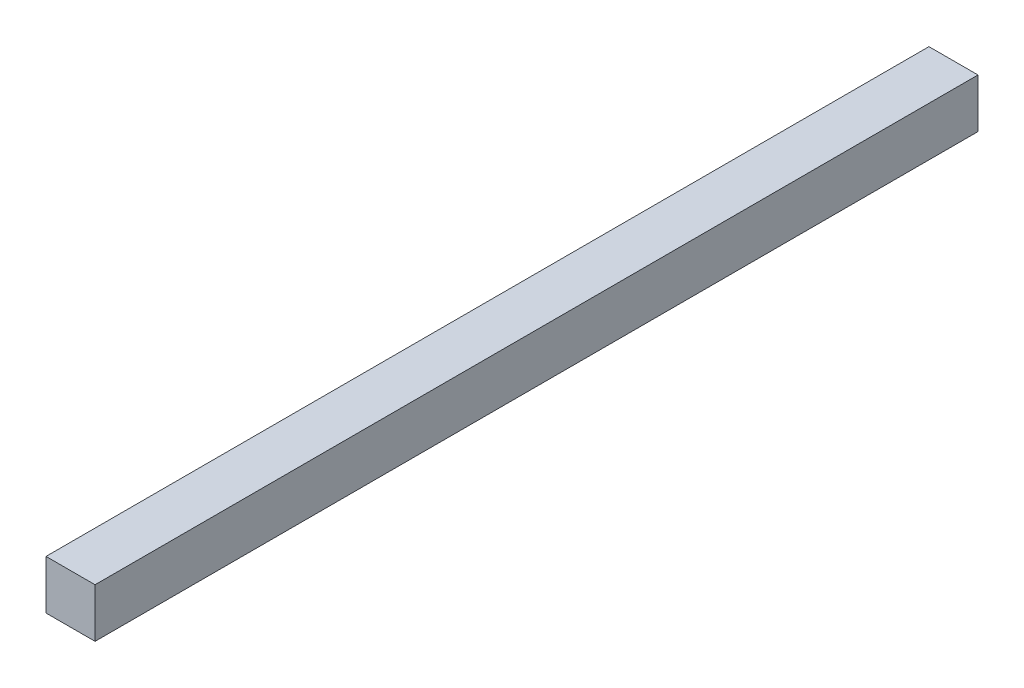
ISO-10303-21;
HEADER;
FILE_DESCRIPTION(('STEP AP214'),'2;1');
FILE_NAME('part.step','',(''),(''),'','','');
FILE_SCHEMA(('AUTOMOTIVE_DESIGN { 1 0 10303 214 1 1 1 1 }'));
ENDSEC;
DATA;
#1=APPLICATION_CONTEXT('core data for automotive mechanical design processes');
#2=APPLICATION_PROTOCOL_DEFINITION('international standard','automotive_design',2000,#1);
#3=PRODUCT_CONTEXT('',#1,'mechanical');
#4=PRODUCT('Part','Part','',(#3));
#5=PRODUCT_RELATED_PRODUCT_CATEGORY('part','',(#4));
#6=PRODUCT_DEFINITION_FORMATION('','',#4);
#7=PRODUCT_DEFINITION_CONTEXT('part definition',#1,'design');
#8=PRODUCT_DEFINITION('design','',#6,#7);
#9=PRODUCT_DEFINITION_SHAPE('','',#8);
#10=(LENGTH_UNIT() NAMED_UNIT(*) SI_UNIT(.MILLI.,.METRE.));
#11=(NAMED_UNIT(*) PLANE_ANGLE_UNIT() SI_UNIT($,.RADIAN.));
#12=(NAMED_UNIT(*) SI_UNIT($,.STERADIAN.) SOLID_ANGLE_UNIT());
#13=UNCERTAINTY_MEASURE_WITH_UNIT(LENGTH_MEASURE(1.E-05),#10,'distance_accuracy_value','');
#14=(GEOMETRIC_REPRESENTATION_CONTEXT(3) GLOBAL_UNCERTAINTY_ASSIGNED_CONTEXT((#13)) GLOBAL_UNIT_ASSIGNED_CONTEXT((#10,
#11,#12)) REPRESENTATION_CONTEXT('',''));
#15=CARTESIAN_POINT('',(0.,0.,0.));
#16=DIRECTION('',(0.,0.,1.));
#17=DIRECTION('',(1.,0.,0.));
#18=AXIS2_PLACEMENT_3D('',#15,#16,#17);
#19=CARTESIAN_POINT('',(0.,0.,457.2));
#20=DIRECTION('',(1.,0.,0.));
#21=DIRECTION('',(0.,1.,0.));
#22=AXIS2_PLACEMENT_3D('',#19,#20,#21);
#23=PLANE('',#22);
#24=DIRECTION('',(0.,-1.,0.));
#25=VECTOR('',#24,1.);
#26=CARTESIAN_POINT('',(0.,0.,0.));
#27=LINE('',#26,#25);
#28=CARTESIAN_POINT('',(0.,0.,0.));
#29=VERTEX_POINT('',#28);
#30=CARTESIAN_POINT('',(0.,-25.4,0.));
#31=VERTEX_POINT('',#30);
#32=EDGE_CURVE('E98',#29,#31,#27,.T.);
#33=ORIENTED_EDGE('',*,*,#32,.F.);
#34=DIRECTION('',(0.,0.,-1.));
#35=VECTOR('',#34,1.);
#36=CARTESIAN_POINT('',(0.,0.,457.2));
#37=LINE('',#36,#35);
#38=CARTESIAN_POINT('',(0.,0.,457.2));
#39=VERTEX_POINT('',#38);
#40=EDGE_CURVE('E11',#39,#29,#37,.T.);
#41=ORIENTED_EDGE('',*,*,#40,.F.);
#42=DIRECTION('',(0.,-1.,0.));
#43=VECTOR('',#42,1.);
#44=CARTESIAN_POINT('',(0.,0.,457.2));
#45=LINE('',#44,#43);
#46=CARTESIAN_POINT('',(0.,-25.4,457.2));
#47=VERTEX_POINT('',#46);
#48=EDGE_CURVE('E93',#39,#47,#45,.T.);
#49=ORIENTED_EDGE('',*,*,#48,.T.);
#50=DIRECTION('',(0.,0.,-1.));
#51=VECTOR('',#50,1.);
#52=CARTESIAN_POINT('',(0.,-25.4,457.2));
#53=LINE('',#52,#51);
#54=EDGE_CURVE('E36',#47,#31,#53,.T.);
#55=ORIENTED_EDGE('',*,*,#54,.T.);
#56=EDGE_LOOP('',(#33,#41,#49,#55));
#57=FACE_BOUND('',#56,.T.);
#58=ADVANCED_FACE('F33',(#57),#23,.T.);
#59=CARTESIAN_POINT('',(0.,0.,457.2));
#60=DIRECTION('',(0.,-1.,0.));
#61=DIRECTION('',(0.,0.,-1.));
#62=AXIS2_PLACEMENT_3D('',#59,#60,#61);
#63=PLANE('',#62);
#64=DIRECTION('',(-1.,0.,0.));
#65=VECTOR('',#64,1.);
#66=CARTESIAN_POINT('',(0.,0.,0.));
#67=LINE('',#66,#65);
#68=CARTESIAN_POINT('',(-25.4,0.,0.));
#69=VERTEX_POINT('',#68);
#70=EDGE_CURVE('E66',#29,#69,#67,.T.);
#71=ORIENTED_EDGE('',*,*,#70,.T.);
#72=DIRECTION('',(0.,0.,-1.));
#73=VECTOR('',#72,1.);
#74=CARTESIAN_POINT('',(-25.4,0.,457.2));
#75=LINE('',#74,#73);
#76=CARTESIAN_POINT('',(-25.4,0.,457.2));
#77=VERTEX_POINT('',#76);
#78=EDGE_CURVE('E42',#77,#69,#75,.T.);
#79=ORIENTED_EDGE('',*,*,#78,.F.);
#80=DIRECTION('',(-1.,0.,0.));
#81=VECTOR('',#80,1.);
#82=CARTESIAN_POINT('',(0.,0.,457.2));
#83=LINE('',#82,#81);
#84=EDGE_CURVE('E83',#39,#77,#83,.T.);
#85=ORIENTED_EDGE('',*,*,#84,.F.);
#86=ORIENTED_EDGE('',*,*,#40,.T.);
#87=EDGE_LOOP('',(#71,#79,#85,#86));
#88=FACE_BOUND('',#87,.T.);
#89=ADVANCED_FACE('F108',(#88),#63,.F.);
#90=CARTESIAN_POINT('',(-25.4,0.,457.2));
#91=DIRECTION('',(1.,0.,0.));
#92=DIRECTION('',(0.,1.,0.));
#93=AXIS2_PLACEMENT_3D('',#90,#91,#92);
#94=PLANE('',#93);
#95=DIRECTION('',(0.,-1.,0.));
#96=VECTOR('',#95,1.);
#97=CARTESIAN_POINT('',(-25.4,0.,0.));
#98=LINE('',#97,#96);
#99=CARTESIAN_POINT('',(-25.4,-25.4,0.));
#100=VERTEX_POINT('',#99);
#101=EDGE_CURVE('E90',#69,#100,#98,.T.);
#102=ORIENTED_EDGE('',*,*,#101,.T.);
#103=DIRECTION('',(0.,0.,-1.));
#104=VECTOR('',#103,1.);
#105=CARTESIAN_POINT('',(-25.4,-25.4,457.2));
#106=LINE('',#105,#104);
#107=CARTESIAN_POINT('',(-25.4,-25.4,457.2));
#108=VERTEX_POINT('',#107);
#109=EDGE_CURVE('E87',#108,#100,#106,.T.);
#110=ORIENTED_EDGE('',*,*,#109,.F.);
#111=DIRECTION('',(0.,-1.,0.));
#112=VECTOR('',#111,1.);
#113=CARTESIAN_POINT('',(-25.4,0.,457.2));
#114=LINE('',#113,#112);
#115=EDGE_CURVE('E78',#77,#108,#114,.T.);
#116=ORIENTED_EDGE('',*,*,#115,.F.);
#117=ORIENTED_EDGE('',*,*,#78,.T.);
#118=EDGE_LOOP('',(#102,#110,#116,#117));
#119=FACE_BOUND('',#118,.T.);
#120=ADVANCED_FACE('F88',(#119),#94,.F.);
#121=CARTESIAN_POINT('',(0.,-25.4,457.2));
#122=DIRECTION('',(0.,-1.,0.));
#123=DIRECTION('',(1.,0.,0.));
#124=AXIS2_PLACEMENT_3D('',#121,#122,#123);
#125=PLANE('',#124);
#126=DIRECTION('',(-1.,0.,0.));
#127=VECTOR('',#126,1.);
#128=CARTESIAN_POINT('',(0.,-25.4,0.));
#129=LINE('',#128,#127);
#130=EDGE_CURVE('E101',#31,#100,#129,.T.);
#131=ORIENTED_EDGE('',*,*,#130,.F.);
#132=ORIENTED_EDGE('',*,*,#54,.F.);
#133=DIRECTION('',(-1.,0.,0.));
#134=VECTOR('',#133,1.);
#135=CARTESIAN_POINT('',(0.,-25.4,457.2));
#136=LINE('',#135,#134);
#137=EDGE_CURVE('E82',#47,#108,#136,.T.);
#138=ORIENTED_EDGE('',*,*,#137,.T.);
#139=ORIENTED_EDGE('',*,*,#109,.T.);
#140=EDGE_LOOP('',(#131,#132,#138,#139));
#141=FACE_BOUND('',#140,.T.);
#142=ADVANCED_FACE('F92',(#141),#125,.T.);
#143=CARTESIAN_POINT('',(0.,0.,457.2));
#144=DIRECTION('',(0.,0.,-1.));
#145=DIRECTION('',(-1.,0.,0.));
#146=AXIS2_PLACEMENT_3D('',#143,#144,#145);
#147=PLANE('',#146);
#148=ORIENTED_EDGE('',*,*,#48,.F.);
#149=ORIENTED_EDGE('',*,*,#84,.T.);
#150=ORIENTED_EDGE('',*,*,#115,.T.);
#151=ORIENTED_EDGE('',*,*,#137,.F.);
#152=EDGE_LOOP('',(#148,#149,#150,#151));
#153=FACE_BOUND('',#152,.T.);
#154=ADVANCED_FACE('F81',(#153),#147,.F.);
#155=CARTESIAN_POINT('',(0.,0.,0.));
#156=DIRECTION('',(0.,0.,-1.));
#157=DIRECTION('',(-1.,0.,0.));
#158=AXIS2_PLACEMENT_3D('',#155,#156,#157);
#159=PLANE('',#158);
#160=ORIENTED_EDGE('',*,*,#32,.T.);
#161=ORIENTED_EDGE('',*,*,#130,.T.);
#162=ORIENTED_EDGE('',*,*,#101,.F.);
#163=ORIENTED_EDGE('',*,*,#70,.F.);
#164=EDGE_LOOP('',(#160,#161,#162,#163));
#165=FACE_BOUND('',#164,.T.);
#166=ADVANCED_FACE('F106',(#165),#159,.T.);
#167=CLOSED_SHELL('',(#58,#89,#120,#142,#154,#166));
#168=MANIFOLD_SOLID_BREP('B2',#167);
#169=ADVANCED_BREP_SHAPE_REPRESENTATION('',(#18,#168),#14);
#170=SHAPE_DEFINITION_REPRESENTATION(#9,#169);
ENDSEC;
END-ISO-10303-21;
